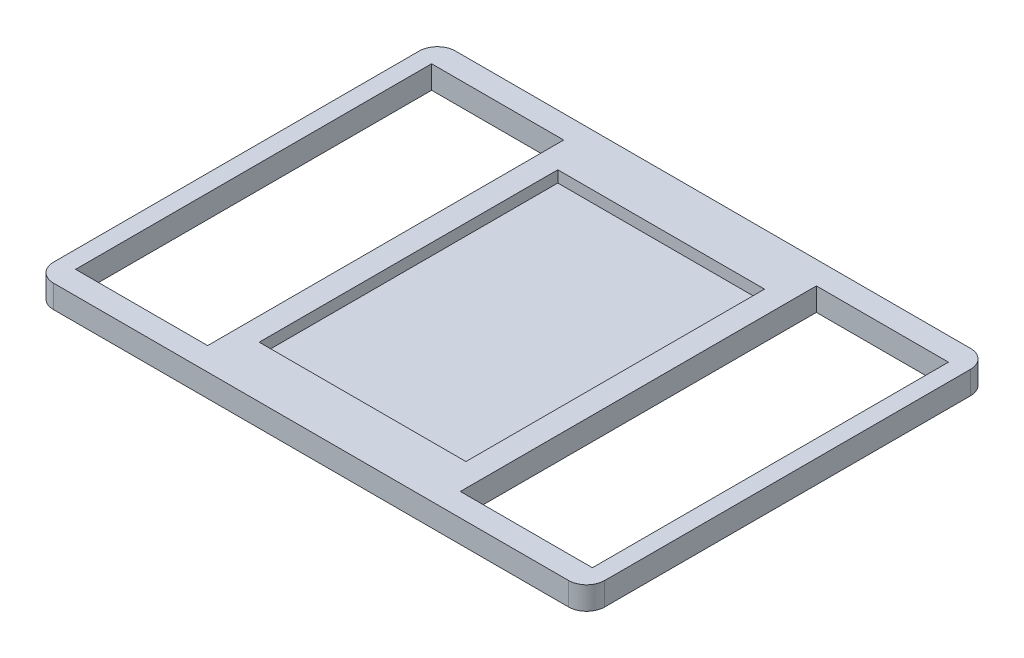
ISO-10303-21;
HEADER;
FILE_DESCRIPTION(('STEP AP214'),'2;1');
FILE_NAME('part.step','',(''),(''),'','','');
FILE_SCHEMA(('AUTOMOTIVE_DESIGN { 1 0 10303 214 1 1 1 1 }'));
ENDSEC;
DATA;
#1=APPLICATION_CONTEXT('core data for automotive mechanical design processes');
#2=APPLICATION_PROTOCOL_DEFINITION('international standard','automotive_design',2000,#1);
#3=PRODUCT_CONTEXT('',#1,'mechanical');
#4=PRODUCT('Part','Part','',(#3));
#5=PRODUCT_RELATED_PRODUCT_CATEGORY('part','',(#4));
#6=PRODUCT_DEFINITION_FORMATION('','',#4);
#7=PRODUCT_DEFINITION_CONTEXT('part definition',#1,'design');
#8=PRODUCT_DEFINITION('design','',#6,#7);
#9=PRODUCT_DEFINITION_SHAPE('','',#8);
#10=(LENGTH_UNIT() NAMED_UNIT(*) SI_UNIT(.MILLI.,.METRE.));
#11=(NAMED_UNIT(*) PLANE_ANGLE_UNIT() SI_UNIT($,.RADIAN.));
#12=(NAMED_UNIT(*) SI_UNIT($,.STERADIAN.) SOLID_ANGLE_UNIT());
#13=UNCERTAINTY_MEASURE_WITH_UNIT(LENGTH_MEASURE(1.E-05),#10,'distance_accuracy_value','');
#14=(GEOMETRIC_REPRESENTATION_CONTEXT(3) GLOBAL_UNCERTAINTY_ASSIGNED_CONTEXT((#13)) GLOBAL_UNIT_ASSIGNED_CONTEXT((#10,
#11,#12)) REPRESENTATION_CONTEXT('',''));
#15=CARTESIAN_POINT('',(0.,0.,0.));
#16=DIRECTION('',(0.,0.,1.));
#17=DIRECTION('',(1.,0.,0.));
#18=AXIS2_PLACEMENT_3D('',#15,#16,#17);
#19=CARTESIAN_POINT('',(4.79892037786772,12.7,0.));
#20=DIRECTION('',(1.,0.,0.));
#21=DIRECTION('',(0.,0.,-1.));
#22=AXIS2_PLACEMENT_3D('',#19,#20,#21);
#23=PLANE('',#22);
#24=DIRECTION('',(0.,0.,1.));
#25=VECTOR('',#24,1.);
#26=CARTESIAN_POINT('',(4.79892037786772,0.,0.));
#27=LINE('',#26,#25);
#28=CARTESIAN_POINT('',(4.79892037786772,0.,-212.25));
#29=VERTEX_POINT('',#28);
#30=CARTESIAN_POINT('',(4.79892037786772,0.,-10.));
#31=VERTEX_POINT('',#30);
#32=EDGE_CURVE('E275',#29,#31,#27,.T.);
#33=ORIENTED_EDGE('',*,*,#32,.T.);
#34=DIRECTION('',(0.,-1.,0.));
#35=VECTOR('',#34,1.);
#36=CARTESIAN_POINT('',(4.79892037786772,12.7,-10.));
#37=LINE('',#36,#35);
#38=CARTESIAN_POINT('',(4.79892037786772,12.7,-10.));
#39=VERTEX_POINT('',#38);
#40=EDGE_CURVE('E11',#31,#39,#37,.F.);
#41=ORIENTED_EDGE('',*,*,#40,.T.);
#42=DIRECTION('',(0.,0.,1.));
#43=VECTOR('',#42,1.);
#44=CARTESIAN_POINT('',(4.79892037786772,12.7,0.));
#45=LINE('',#44,#43);
#46=CARTESIAN_POINT('',(4.79892037786772,12.7,-212.25));
#47=VERTEX_POINT('',#46);
#48=EDGE_CURVE('E327',#47,#39,#45,.T.);
#49=ORIENTED_EDGE('',*,*,#48,.F.);
#50=DIRECTION('',(0.,-1.,0.));
#51=VECTOR('',#50,1.);
#52=CARTESIAN_POINT('',(4.79892037786772,12.7,-212.25));
#53=LINE('',#52,#51);
#54=EDGE_CURVE('E54',#47,#29,#53,.T.);
#55=ORIENTED_EDGE('',*,*,#54,.T.);
#56=EDGE_LOOP('',(#33,#41,#49,#55));
#57=FACE_BOUND('',#56,.T.);
#58=ADVANCED_FACE('F45',(#57),#23,.F.);
#59=CARTESIAN_POINT('',(4.79892037786772,12.7,0.));
#60=DIRECTION('',(0.,0.,-1.));
#61=DIRECTION('',(-1.,0.,0.));
#62=AXIS2_PLACEMENT_3D('',#59,#60,#61);
#63=PLANE('',#62);
#64=DIRECTION('',(1.,0.,0.));
#65=VECTOR('',#64,1.);
#66=CARTESIAN_POINT('',(4.79892037786772,0.,0.));
#67=LINE('',#66,#65);
#68=CARTESIAN_POINT('',(14.7989203778677,0.,0.));
#69=VERTEX_POINT('',#68);
#70=CARTESIAN_POINT('',(299.598920377868,0.,0.));
#71=VERTEX_POINT('',#70);
#72=EDGE_CURVE('E346',#69,#71,#67,.T.);
#73=ORIENTED_EDGE('',*,*,#72,.T.);
#74=DIRECTION('',(0.,-1.,0.));
#75=VECTOR('',#74,1.);
#76=CARTESIAN_POINT('',(299.598920377868,12.7,0.));
#77=LINE('',#76,#75);
#78=CARTESIAN_POINT('',(299.598920377868,12.7,0.));
#79=VERTEX_POINT('',#78);
#80=EDGE_CURVE('E61',#71,#79,#77,.F.);
#81=ORIENTED_EDGE('',*,*,#80,.T.);
#82=DIRECTION('',(1.,0.,0.));
#83=VECTOR('',#82,1.);
#84=CARTESIAN_POINT('',(4.79892037786772,12.7,0.));
#85=LINE('',#84,#83);
#86=CARTESIAN_POINT('',(14.7989203778677,12.7,0.));
#87=VERTEX_POINT('',#86);
#88=EDGE_CURVE('E330',#87,#79,#85,.T.);
#89=ORIENTED_EDGE('',*,*,#88,.F.);
#90=DIRECTION('',(0.,-1.,0.));
#91=VECTOR('',#90,1.);
#92=CARTESIAN_POINT('',(14.7989203778677,12.7,0.));
#93=LINE('',#92,#91);
#94=EDGE_CURVE('E392',#87,#69,#93,.T.);
#95=ORIENTED_EDGE('',*,*,#94,.T.);
#96=EDGE_LOOP('',(#73,#81,#89,#95));
#97=FACE_BOUND('',#96,.T.);
#98=ADVANCED_FACE('F413',(#97),#63,.F.);
#99=CARTESIAN_POINT('',(309.598920377868,12.7,0.));
#100=DIRECTION('',(-1.,0.,0.));
#101=DIRECTION('',(0.,0.,1.));
#102=AXIS2_PLACEMENT_3D('',#99,#100,#101);
#103=PLANE('',#102);
#104=DIRECTION('',(0.,0.,-1.));
#105=VECTOR('',#104,1.);
#106=CARTESIAN_POINT('',(309.598920377868,0.,0.));
#107=LINE('',#106,#105);
#108=CARTESIAN_POINT('',(309.598920377868,0.,-10.));
#109=VERTEX_POINT('',#108);
#110=CARTESIAN_POINT('',(309.598920377868,0.,-212.25));
#111=VERTEX_POINT('',#110);
#112=EDGE_CURVE('E349',#109,#111,#107,.T.);
#113=ORIENTED_EDGE('',*,*,#112,.T.);
#114=DIRECTION('',(0.,-1.,0.));
#115=VECTOR('',#114,1.);
#116=CARTESIAN_POINT('',(309.598920377868,12.7,-212.25));
#117=LINE('',#116,#115);
#118=CARTESIAN_POINT('',(309.598920377868,12.7,-212.25));
#119=VERTEX_POINT('',#118);
#120=EDGE_CURVE('E378',#111,#119,#117,.F.);
#121=ORIENTED_EDGE('',*,*,#120,.T.);
#122=DIRECTION('',(0.,0.,-1.));
#123=VECTOR('',#122,1.);
#124=CARTESIAN_POINT('',(309.598920377868,12.7,0.));
#125=LINE('',#124,#123);
#126=CARTESIAN_POINT('',(309.598920377868,12.7,-10.));
#127=VERTEX_POINT('',#126);
#128=EDGE_CURVE('E334',#127,#119,#125,.T.);
#129=ORIENTED_EDGE('',*,*,#128,.F.);
#130=DIRECTION('',(0.,-1.,0.));
#131=VECTOR('',#130,1.);
#132=CARTESIAN_POINT('',(309.598920377868,12.7,-10.));
#133=LINE('',#132,#131);
#134=EDGE_CURVE('E374',#127,#109,#133,.T.);
#135=ORIENTED_EDGE('',*,*,#134,.T.);
#136=EDGE_LOOP('',(#113,#121,#129,#135));
#137=FACE_BOUND('',#136,.T.);
#138=ADVANCED_FACE('F422',(#137),#103,.F.);
#139=CARTESIAN_POINT('',(4.79892037786772,12.7,-222.25));
#140=DIRECTION('',(0.,0.,1.));
#141=DIRECTION('',(1.,0.,0.));
#142=AXIS2_PLACEMENT_3D('',#139,#140,#141);
#143=PLANE('',#142);
#144=DIRECTION('',(-1.,0.,0.));
#145=VECTOR('',#144,1.);
#146=CARTESIAN_POINT('',(4.79892037786772,12.7,-222.25));
#147=LINE('',#146,#145);
#148=CARTESIAN_POINT('',(299.598920377868,12.7,-222.25));
#149=VERTEX_POINT('',#148);
#150=CARTESIAN_POINT('',(14.7989203778677,12.7,-222.25));
#151=VERTEX_POINT('',#150);
#152=EDGE_CURVE('E338',#149,#151,#147,.T.);
#153=ORIENTED_EDGE('',*,*,#152,.F.);
#154=DIRECTION('',(0.,-1.,0.));
#155=VECTOR('',#154,1.);
#156=CARTESIAN_POINT('',(299.598920377868,12.7,-222.25));
#157=LINE('',#156,#155);
#158=CARTESIAN_POINT('',(299.598920377868,0.,-222.25));
#159=VERTEX_POINT('',#158);
#160=EDGE_CURVE('E358',#149,#159,#157,.T.);
#161=ORIENTED_EDGE('',*,*,#160,.T.);
#162=DIRECTION('',(-1.,0.,0.));
#163=VECTOR('',#162,1.);
#164=CARTESIAN_POINT('',(4.79892037786772,0.,-222.25));
#165=LINE('',#164,#163);
#166=CARTESIAN_POINT('',(14.7989203778677,0.,-222.25));
#167=VERTEX_POINT('',#166);
#168=EDGE_CURVE('E331',#159,#167,#165,.T.);
#169=ORIENTED_EDGE('',*,*,#168,.T.);
#170=DIRECTION('',(0.,-1.,0.));
#171=VECTOR('',#170,1.);
#172=CARTESIAN_POINT('',(14.7989203778677,12.7,-222.25));
#173=LINE('',#172,#171);
#174=EDGE_CURVE('E342',#167,#151,#173,.F.);
#175=ORIENTED_EDGE('',*,*,#174,.T.);
#176=EDGE_LOOP('',(#153,#161,#169,#175));
#177=FACE_BOUND('',#176,.T.);
#178=ADVANCED_FACE('F430',(#177),#143,.F.);
#179=CARTESIAN_POINT('',(0.,12.7,0.));
#180=DIRECTION('',(0.,-1.,0.));
#181=DIRECTION('',(0.,0.,-1.));
#182=AXIS2_PLACEMENT_3D('',#179,#180,#181);
#183=PLANE('',#182);
#184=DIRECTION('',(1.,0.,0.));
#185=VECTOR('',#184,1.);
#186=CARTESIAN_POINT('',(99.9733942441962,12.7,-28.575));
#187=LINE('',#186,#185);
#188=CARTESIAN_POINT('',(99.9733942441962,12.7,-28.575));
#189=VERTEX_POINT('',#188);
#190=CARTESIAN_POINT('',(214.273394244196,12.7,-28.575));
#191=VERTEX_POINT('',#190);
#192=EDGE_CURVE('E224',#189,#191,#187,.T.);
#193=ORIENTED_EDGE('',*,*,#192,.F.);
#194=DIRECTION('',(0.,0.,1.));
#195=VECTOR('',#194,1.);
#196=CARTESIAN_POINT('',(99.9733942441962,12.7,-193.675));
#197=LINE('',#196,#195);
#198=CARTESIAN_POINT('',(99.9733942441962,12.7,-193.675));
#199=VERTEX_POINT('',#198);
#200=EDGE_CURVE('E191',#199,#189,#197,.T.);
#201=ORIENTED_EDGE('',*,*,#200,.F.);
#202=DIRECTION('',(-1.,0.,0.));
#203=VECTOR('',#202,1.);
#204=CARTESIAN_POINT('',(99.9733942441962,12.7,-193.675));
#205=LINE('',#204,#203);
#206=CARTESIAN_POINT('',(214.273394244196,12.7,-193.675));
#207=VERTEX_POINT('',#206);
#208=EDGE_CURVE('E211',#207,#199,#205,.T.);
#209=ORIENTED_EDGE('',*,*,#208,.F.);
#210=DIRECTION('',(0.,0.,-1.));
#211=VECTOR('',#210,1.);
#212=CARTESIAN_POINT('',(214.273394244196,12.7,-193.675));
#213=LINE('',#212,#211);
#214=EDGE_CURVE('E215',#191,#207,#213,.T.);
#215=ORIENTED_EDGE('',*,*,#214,.F.);
#216=EDGE_LOOP('',(#193,#201,#209,#215));
#217=FACE_BOUND('',#216,.T.);
#218=DIRECTION('',(1.,0.,0.));
#219=VECTOR('',#218,1.);
#220=CARTESIAN_POINT('',(14.3239203778677,12.7,-12.7));
#221=LINE('',#220,#219);
#222=CARTESIAN_POINT('',(14.3239203778677,12.7,-12.7));
#223=VERTEX_POINT('',#222);
#224=CARTESIAN_POINT('',(87.3489203778677,12.7,-12.7));
#225=VERTEX_POINT('',#224);
#226=EDGE_CURVE('E260',#223,#225,#221,.T.);
#227=ORIENTED_EDGE('',*,*,#226,.F.);
#228=DIRECTION('',(0.,0.,1.));
#229=VECTOR('',#228,1.);
#230=CARTESIAN_POINT('',(14.3239203778677,12.7,-209.55));
#231=LINE('',#230,#229);
#232=CARTESIAN_POINT('',(14.3239203778677,12.7,-209.55));
#233=VERTEX_POINT('',#232);
#234=EDGE_CURVE('E257',#233,#223,#231,.T.);
#235=ORIENTED_EDGE('',*,*,#234,.F.);
#236=DIRECTION('',(-1.,0.,0.));
#237=VECTOR('',#236,1.);
#238=CARTESIAN_POINT('',(14.3239203778677,12.7,-209.55));
#239=LINE('',#238,#237);
#240=CARTESIAN_POINT('',(87.3489203778677,12.7,-209.55));
#241=VERTEX_POINT('',#240);
#242=EDGE_CURVE('E244',#241,#233,#239,.T.);
#243=ORIENTED_EDGE('',*,*,#242,.F.);
#244=DIRECTION('',(0.,0.,-1.));
#245=VECTOR('',#244,1.);
#246=CARTESIAN_POINT('',(87.3489203778677,12.7,-209.55));
#247=LINE('',#246,#245);
#248=EDGE_CURVE('E265',#225,#241,#247,.T.);
#249=ORIENTED_EDGE('',*,*,#248,.F.);
#250=EDGE_LOOP('',(#227,#235,#243,#249));
#251=FACE_BOUND('',#250,.T.);
#252=DIRECTION('',(1.,0.,0.));
#253=VECTOR('',#252,1.);
#254=CARTESIAN_POINT('',(227.048920377868,12.7,-12.7));
#255=LINE('',#254,#253);
#256=CARTESIAN_POINT('',(227.048920377868,12.7,-12.7));
#257=VERTEX_POINT('',#256);
#258=CARTESIAN_POINT('',(300.073920377868,12.7,-12.7));
#259=VERTEX_POINT('',#258);
#260=EDGE_CURVE('E307',#257,#259,#255,.T.);
#261=ORIENTED_EDGE('',*,*,#260,.F.);
#262=DIRECTION('',(0.,0.,1.));
#263=VECTOR('',#262,1.);
#264=CARTESIAN_POINT('',(227.048920377868,12.7,-209.55));
#265=LINE('',#264,#263);
#266=CARTESIAN_POINT('',(227.048920377868,12.7,-209.55));
#267=VERTEX_POINT('',#266);
#268=EDGE_CURVE('E261',#267,#257,#265,.T.);
#269=ORIENTED_EDGE('',*,*,#268,.F.);
#270=DIRECTION('',(-1.,0.,0.));
#271=VECTOR('',#270,1.);
#272=CARTESIAN_POINT('',(227.048920377868,12.7,-209.55));
#273=LINE('',#272,#271);
#274=CARTESIAN_POINT('',(300.073920377868,12.7,-209.55));
#275=VERTEX_POINT('',#274);
#276=EDGE_CURVE('E298',#275,#267,#273,.T.);
#277=ORIENTED_EDGE('',*,*,#276,.F.);
#278=DIRECTION('',(0.,0.,-1.));
#279=VECTOR('',#278,1.);
#280=CARTESIAN_POINT('',(300.073920377868,12.7,-209.55));
#281=LINE('',#280,#279);
#282=EDGE_CURVE('E302',#259,#275,#281,.T.);
#283=ORIENTED_EDGE('',*,*,#282,.F.);
#284=EDGE_LOOP('',(#261,#269,#277,#283));
#285=FACE_BOUND('',#284,.T.);
#286=ORIENTED_EDGE('',*,*,#128,.T.);
#287=CARTESIAN_POINT('',(299.598920377868,12.7,-212.25));
#288=DIRECTION('',(0.,-1.,0.));
#289=DIRECTION('',(0.,0.,-1.));
#290=AXIS2_PLACEMENT_3D('',#287,#288,#289);
#291=CIRCLE('',#290,10.);
#292=EDGE_CURVE('E389',#119,#149,#291,.F.);
#293=ORIENTED_EDGE('',*,*,#292,.T.);
#294=ORIENTED_EDGE('',*,*,#152,.T.);
#295=CARTESIAN_POINT('',(14.7989203778677,12.7,-212.25));
#296=DIRECTION('',(0.,-1.,0.));
#297=DIRECTION('',(0.,0.,-1.));
#298=AXIS2_PLACEMENT_3D('',#295,#296,#297);
#299=CIRCLE('',#298,10.);
#300=EDGE_CURVE('E381',#151,#47,#299,.F.);
#301=ORIENTED_EDGE('',*,*,#300,.T.);
#302=ORIENTED_EDGE('',*,*,#48,.T.);
#303=CARTESIAN_POINT('',(14.7989203778677,12.7,-10.));
#304=DIRECTION('',(0.,-1.,0.));
#305=DIRECTION('',(0.,0.,-1.));
#306=AXIS2_PLACEMENT_3D('',#303,#304,#305);
#307=CIRCLE('',#306,10.);
#308=EDGE_CURVE('E68',#39,#87,#307,.F.);
#309=ORIENTED_EDGE('',*,*,#308,.T.);
#310=ORIENTED_EDGE('',*,*,#88,.T.);
#311=CARTESIAN_POINT('',(299.598920377868,12.7,-10.));
#312=DIRECTION('',(0.,-1.,0.));
#313=DIRECTION('',(0.,0.,-1.));
#314=AXIS2_PLACEMENT_3D('',#311,#312,#313);
#315=CIRCLE('',#314,10.);
#316=EDGE_CURVE('E386',#79,#127,#315,.F.);
#317=ORIENTED_EDGE('',*,*,#316,.T.);
#318=EDGE_LOOP('',(#286,#293,#294,#301,#302,#309,#310,#317));
#319=FACE_BOUND('',#318,.T.);
#320=ADVANCED_FACE('F415',(#217,#251,#285,#319),#183,.F.);
#321=CARTESIAN_POINT('',(0.,0.,0.));
#322=DIRECTION('',(0.,-1.,0.));
#323=DIRECTION('',(0.,0.,-1.));
#324=AXIS2_PLACEMENT_3D('',#321,#322,#323);
#325=PLANE('',#324);
#326=DIRECTION('',(0.,0.,1.));
#327=VECTOR('',#326,1.);
#328=CARTESIAN_POINT('',(14.3239203778677,0.,-209.55));
#329=LINE('',#328,#327);
#330=CARTESIAN_POINT('',(14.3239203778677,0.,-209.55));
#331=VERTEX_POINT('',#330);
#332=CARTESIAN_POINT('',(14.3239203778677,0.,-12.7));
#333=VERTEX_POINT('',#332);
#334=EDGE_CURVE('E239',#331,#333,#329,.T.);
#335=ORIENTED_EDGE('',*,*,#334,.T.);
#336=DIRECTION('',(1.,0.,0.));
#337=VECTOR('',#336,1.);
#338=CARTESIAN_POINT('',(14.3239203778677,0.,-12.7));
#339=LINE('',#338,#337);
#340=CARTESIAN_POINT('',(87.3489203778677,0.,-12.7));
#341=VERTEX_POINT('',#340);
#342=EDGE_CURVE('E243',#333,#341,#339,.T.);
#343=ORIENTED_EDGE('',*,*,#342,.T.);
#344=DIRECTION('',(0.,0.,-1.));
#345=VECTOR('',#344,1.);
#346=CARTESIAN_POINT('',(87.3489203778677,0.,-209.55));
#347=LINE('',#346,#345);
#348=CARTESIAN_POINT('',(87.3489203778677,0.,-209.55));
#349=VERTEX_POINT('',#348);
#350=EDGE_CURVE('E248',#341,#349,#347,.T.);
#351=ORIENTED_EDGE('',*,*,#350,.T.);
#352=DIRECTION('',(-1.,0.,0.));
#353=VECTOR('',#352,1.);
#354=CARTESIAN_POINT('',(14.3239203778677,0.,-209.55));
#355=LINE('',#354,#353);
#356=EDGE_CURVE('E252',#349,#331,#355,.T.);
#357=ORIENTED_EDGE('',*,*,#356,.T.);
#358=EDGE_LOOP('',(#335,#343,#351,#357));
#359=FACE_BOUND('',#358,.T.);
#360=DIRECTION('',(0.,0.,1.));
#361=VECTOR('',#360,1.);
#362=CARTESIAN_POINT('',(227.048920377868,0.,-209.55));
#363=LINE('',#362,#361);
#364=CARTESIAN_POINT('',(227.048920377868,0.,-209.55));
#365=VERTEX_POINT('',#364);
#366=CARTESIAN_POINT('',(227.048920377868,0.,-12.7));
#367=VERTEX_POINT('',#366);
#368=EDGE_CURVE('E303',#365,#367,#363,.T.);
#369=ORIENTED_EDGE('',*,*,#368,.T.);
#370=DIRECTION('',(1.,0.,0.));
#371=VECTOR('',#370,1.);
#372=CARTESIAN_POINT('',(227.048920377868,0.,-12.7));
#373=LINE('',#372,#371);
#374=CARTESIAN_POINT('',(300.073920377868,0.,-12.7));
#375=VERTEX_POINT('',#374);
#376=EDGE_CURVE('E320',#367,#375,#373,.T.);
#377=ORIENTED_EDGE('',*,*,#376,.T.);
#378=DIRECTION('',(0.,0.,-1.));
#379=VECTOR('',#378,1.);
#380=CARTESIAN_POINT('',(300.073920377868,0.,-209.55));
#381=LINE('',#380,#379);
#382=CARTESIAN_POINT('',(300.073920377868,0.,-209.55));
#383=VERTEX_POINT('',#382);
#384=EDGE_CURVE('E316',#375,#383,#381,.T.);
#385=ORIENTED_EDGE('',*,*,#384,.T.);
#386=DIRECTION('',(-1.,0.,0.));
#387=VECTOR('',#386,1.);
#388=CARTESIAN_POINT('',(227.048920377868,0.,-209.55));
#389=LINE('',#388,#387);
#390=EDGE_CURVE('E289',#383,#365,#389,.T.);
#391=ORIENTED_EDGE('',*,*,#390,.T.);
#392=EDGE_LOOP('',(#369,#377,#385,#391));
#393=FACE_BOUND('',#392,.T.);
#394=ORIENTED_EDGE('',*,*,#168,.F.);
#395=CARTESIAN_POINT('',(299.598920377868,0.,-212.25));
#396=DIRECTION('',(0.,-1.,0.));
#397=DIRECTION('',(0.,0.,-1.));
#398=AXIS2_PLACEMENT_3D('',#395,#396,#397);
#399=CIRCLE('',#398,10.);
#400=EDGE_CURVE('E371',#159,#111,#399,.T.);
#401=ORIENTED_EDGE('',*,*,#400,.T.);
#402=ORIENTED_EDGE('',*,*,#112,.F.);
#403=CARTESIAN_POINT('',(299.598920377868,0.,-10.));
#404=DIRECTION('',(0.,-1.,0.));
#405=DIRECTION('',(0.,0.,-1.));
#406=AXIS2_PLACEMENT_3D('',#403,#404,#405);
#407=CIRCLE('',#406,10.);
#408=EDGE_CURVE('E368',#109,#71,#407,.T.);
#409=ORIENTED_EDGE('',*,*,#408,.T.);
#410=ORIENTED_EDGE('',*,*,#72,.F.);
#411=CARTESIAN_POINT('',(14.7989203778677,0.,-10.));
#412=DIRECTION('',(0.,-1.,0.));
#413=DIRECTION('',(0.,0.,-1.));
#414=AXIS2_PLACEMENT_3D('',#411,#412,#413);
#415=CIRCLE('',#414,10.);
#416=EDGE_CURVE('E365',#69,#31,#415,.T.);
#417=ORIENTED_EDGE('',*,*,#416,.T.);
#418=ORIENTED_EDGE('',*,*,#32,.F.);
#419=CARTESIAN_POINT('',(14.7989203778677,0.,-212.25));
#420=DIRECTION('',(0.,-1.,0.));
#421=DIRECTION('',(0.,0.,-1.));
#422=AXIS2_PLACEMENT_3D('',#419,#420,#421);
#423=CIRCLE('',#422,10.);
#424=EDGE_CURVE('E362',#29,#167,#423,.T.);
#425=ORIENTED_EDGE('',*,*,#424,.T.);
#426=EDGE_LOOP('',(#394,#401,#402,#409,#410,#417,#418,#425));
#427=FACE_BOUND('',#426,.T.);
#428=ADVANCED_FACE('F408',(#359,#393,#427),#325,.T.);
#429=CARTESIAN_POINT('',(227.048920377868,0.,-209.55));
#430=DIRECTION('',(-1.,0.,0.));
#431=DIRECTION('',(0.,0.,1.));
#432=AXIS2_PLACEMENT_3D('',#429,#430,#431);
#433=PLANE('',#432);
#434=ORIENTED_EDGE('',*,*,#268,.T.);
#435=DIRECTION('',(0.,1.,0.));
#436=VECTOR('',#435,1.);
#437=CARTESIAN_POINT('',(227.048920377868,0.,-12.7));
#438=LINE('',#437,#436);
#439=EDGE_CURVE('E285',#367,#257,#438,.T.);
#440=ORIENTED_EDGE('',*,*,#439,.F.);
#441=ORIENTED_EDGE('',*,*,#368,.F.);
#442=DIRECTION('',(0.,1.,0.));
#443=VECTOR('',#442,1.);
#444=CARTESIAN_POINT('',(227.048920377868,0.,-209.55));
#445=LINE('',#444,#443);
#446=EDGE_CURVE('E233',#365,#267,#445,.T.);
#447=ORIENTED_EDGE('',*,*,#446,.T.);
#448=EDGE_LOOP('',(#434,#440,#441,#447));
#449=FACE_BOUND('',#448,.T.);
#450=ADVANCED_FACE('F569',(#449),#433,.F.);
#451=CARTESIAN_POINT('',(227.048920377868,0.,-209.55));
#452=DIRECTION('',(0.,0.,-1.));
#453=DIRECTION('',(-1.,0.,0.));
#454=AXIS2_PLACEMENT_3D('',#451,#452,#453);
#455=PLANE('',#454);
#456=ORIENTED_EDGE('',*,*,#276,.T.);
#457=ORIENTED_EDGE('',*,*,#446,.F.);
#458=ORIENTED_EDGE('',*,*,#390,.F.);
#459=DIRECTION('',(0.,1.,0.));
#460=VECTOR('',#459,1.);
#461=CARTESIAN_POINT('',(300.073920377868,0.,-209.55));
#462=LINE('',#461,#460);
#463=EDGE_CURVE('E293',#383,#275,#462,.T.);
#464=ORIENTED_EDGE('',*,*,#463,.T.);
#465=EDGE_LOOP('',(#456,#457,#458,#464));
#466=FACE_BOUND('',#465,.T.);
#467=ADVANCED_FACE('F560',(#466),#455,.F.);
#468=CARTESIAN_POINT('',(300.073920377868,0.,-209.55));
#469=DIRECTION('',(1.,0.,0.));
#470=DIRECTION('',(0.,0.,-1.));
#471=AXIS2_PLACEMENT_3D('',#468,#469,#470);
#472=PLANE('',#471);
#473=ORIENTED_EDGE('',*,*,#282,.T.);
#474=ORIENTED_EDGE('',*,*,#463,.F.);
#475=ORIENTED_EDGE('',*,*,#384,.F.);
#476=DIRECTION('',(0.,1.,0.));
#477=VECTOR('',#476,1.);
#478=CARTESIAN_POINT('',(300.073920377868,0.,-12.7));
#479=LINE('',#478,#477);
#480=EDGE_CURVE('E290',#375,#259,#479,.T.);
#481=ORIENTED_EDGE('',*,*,#480,.T.);
#482=EDGE_LOOP('',(#473,#474,#475,#481));
#483=FACE_BOUND('',#482,.T.);
#484=ADVANCED_FACE('F551',(#483),#472,.F.);
#485=CARTESIAN_POINT('',(227.048920377868,0.,-12.7));
#486=DIRECTION('',(0.,0.,1.));
#487=DIRECTION('',(1.,0.,0.));
#488=AXIS2_PLACEMENT_3D('',#485,#486,#487);
#489=PLANE('',#488);
#490=ORIENTED_EDGE('',*,*,#260,.T.);
#491=ORIENTED_EDGE('',*,*,#480,.F.);
#492=ORIENTED_EDGE('',*,*,#376,.F.);
#493=ORIENTED_EDGE('',*,*,#439,.T.);
#494=EDGE_LOOP('',(#490,#491,#492,#493));
#495=FACE_BOUND('',#494,.T.);
#496=ADVANCED_FACE('F542',(#495),#489,.F.);
#497=CARTESIAN_POINT('',(14.3239203778677,0.,-209.55));
#498=DIRECTION('',(-1.,0.,0.));
#499=DIRECTION('',(0.,0.,1.));
#500=AXIS2_PLACEMENT_3D('',#497,#498,#499);
#501=PLANE('',#500);
#502=ORIENTED_EDGE('',*,*,#234,.T.);
#503=DIRECTION('',(0.,1.,0.));
#504=VECTOR('',#503,1.);
#505=CARTESIAN_POINT('',(14.3239203778677,0.,-12.7));
#506=LINE('',#505,#504);
#507=EDGE_CURVE('E256',#333,#223,#506,.T.);
#508=ORIENTED_EDGE('',*,*,#507,.F.);
#509=ORIENTED_EDGE('',*,*,#334,.F.);
#510=DIRECTION('',(0.,1.,0.));
#511=VECTOR('',#510,1.);
#512=CARTESIAN_POINT('',(14.3239203778677,0.,-209.55));
#513=LINE('',#512,#511);
#514=EDGE_CURVE('E272',#331,#233,#513,.T.);
#515=ORIENTED_EDGE('',*,*,#514,.T.);
#516=EDGE_LOOP('',(#502,#508,#509,#515));
#517=FACE_BOUND('',#516,.T.);
#518=ADVANCED_FACE('F533',(#517),#501,.F.);
#519=CARTESIAN_POINT('',(14.3239203778677,0.,-209.55));
#520=DIRECTION('',(0.,0.,-1.));
#521=DIRECTION('',(-1.,0.,0.));
#522=AXIS2_PLACEMENT_3D('',#519,#520,#521);
#523=PLANE('',#522);
#524=ORIENTED_EDGE('',*,*,#242,.T.);
#525=ORIENTED_EDGE('',*,*,#514,.F.);
#526=ORIENTED_EDGE('',*,*,#356,.F.);
#527=DIRECTION('',(0.,1.,0.));
#528=VECTOR('',#527,1.);
#529=CARTESIAN_POINT('',(87.3489203778677,0.,-209.55));
#530=LINE('',#529,#528);
#531=EDGE_CURVE('E276',#349,#241,#530,.T.);
#532=ORIENTED_EDGE('',*,*,#531,.T.);
#533=EDGE_LOOP('',(#524,#525,#526,#532));
#534=FACE_BOUND('',#533,.T.);
#535=ADVANCED_FACE('F524',(#534),#523,.F.);
#536=CARTESIAN_POINT('',(87.3489203778677,0.,-209.55));
#537=DIRECTION('',(1.,0.,0.));
#538=DIRECTION('',(0.,0.,-1.));
#539=AXIS2_PLACEMENT_3D('',#536,#537,#538);
#540=PLANE('',#539);
#541=ORIENTED_EDGE('',*,*,#248,.T.);
#542=ORIENTED_EDGE('',*,*,#531,.F.);
#543=ORIENTED_EDGE('',*,*,#350,.F.);
#544=DIRECTION('',(0.,1.,0.));
#545=VECTOR('',#544,1.);
#546=CARTESIAN_POINT('',(87.3489203778677,0.,-12.7));
#547=LINE('',#546,#545);
#548=EDGE_CURVE('E279',#341,#225,#547,.T.);
#549=ORIENTED_EDGE('',*,*,#548,.T.);
#550=EDGE_LOOP('',(#541,#542,#543,#549));
#551=FACE_BOUND('',#550,.T.);
#552=ADVANCED_FACE('F515',(#551),#540,.F.);
#553=CARTESIAN_POINT('',(14.3239203778677,0.,-12.7));
#554=DIRECTION('',(0.,0.,1.));
#555=DIRECTION('',(1.,0.,0.));
#556=AXIS2_PLACEMENT_3D('',#553,#554,#555);
#557=PLANE('',#556);
#558=ORIENTED_EDGE('',*,*,#226,.T.);
#559=ORIENTED_EDGE('',*,*,#548,.F.);
#560=ORIENTED_EDGE('',*,*,#342,.F.);
#561=ORIENTED_EDGE('',*,*,#507,.T.);
#562=EDGE_LOOP('',(#558,#559,#560,#561));
#563=FACE_BOUND('',#562,.T.);
#564=ADVANCED_FACE('F507',(#563),#557,.F.);
#565=CARTESIAN_POINT('',(99.9733942441962,6.35,-193.675));
#566=DIRECTION('',(-1.,0.,0.));
#567=DIRECTION('',(0.,0.,1.));
#568=AXIS2_PLACEMENT_3D('',#565,#566,#567);
#569=PLANE('',#568);
#570=ORIENTED_EDGE('',*,*,#200,.T.);
#571=DIRECTION('',(0.,1.,0.));
#572=VECTOR('',#571,1.);
#573=CARTESIAN_POINT('',(99.9733942441962,6.35,-28.575));
#574=LINE('',#573,#572);
#575=CARTESIAN_POINT('',(99.9733942441962,6.35,-28.575));
#576=VERTEX_POINT('',#575);
#577=EDGE_CURVE('E184',#576,#189,#574,.T.);
#578=ORIENTED_EDGE('',*,*,#577,.F.);
#579=DIRECTION('',(0.,0.,1.));
#580=VECTOR('',#579,1.);
#581=CARTESIAN_POINT('',(99.9733942441962,6.35,-193.675));
#582=LINE('',#581,#580);
#583=CARTESIAN_POINT('',(99.9733942441962,6.35,-193.675));
#584=VERTEX_POINT('',#583);
#585=EDGE_CURVE('E188',#584,#576,#582,.T.);
#586=ORIENTED_EDGE('',*,*,#585,.F.);
#587=DIRECTION('',(0.,1.,0.));
#588=VECTOR('',#587,1.);
#589=CARTESIAN_POINT('',(99.9733942441962,6.35,-193.675));
#590=LINE('',#589,#588);
#591=EDGE_CURVE('E230',#584,#199,#590,.T.);
#592=ORIENTED_EDGE('',*,*,#591,.T.);
#593=EDGE_LOOP('',(#570,#578,#586,#592));
#594=FACE_BOUND('',#593,.T.);
#595=ADVANCED_FACE('F186',(#594),#569,.F.);
#596=CARTESIAN_POINT('',(99.9733942441962,6.35,-193.675));
#597=DIRECTION('',(0.,0.,-1.));
#598=DIRECTION('',(-1.,0.,0.));
#599=AXIS2_PLACEMENT_3D('',#596,#597,#598);
#600=PLANE('',#599);
#601=ORIENTED_EDGE('',*,*,#208,.T.);
#602=ORIENTED_EDGE('',*,*,#591,.F.);
#603=DIRECTION('',(-1.,0.,0.));
#604=VECTOR('',#603,1.);
#605=CARTESIAN_POINT('',(99.9733942441962,6.35,-193.675));
#606=LINE('',#605,#604);
#607=CARTESIAN_POINT('',(214.273394244196,6.35,-193.675));
#608=VERTEX_POINT('',#607);
#609=EDGE_CURVE('E197',#608,#584,#606,.T.);
#610=ORIENTED_EDGE('',*,*,#609,.F.);
#611=DIRECTION('',(0.,1.,0.));
#612=VECTOR('',#611,1.);
#613=CARTESIAN_POINT('',(214.273394244196,6.35,-193.675));
#614=LINE('',#613,#612);
#615=EDGE_CURVE('E234',#608,#207,#614,.T.);
#616=ORIENTED_EDGE('',*,*,#615,.T.);
#617=EDGE_LOOP('',(#601,#602,#610,#616));
#618=FACE_BOUND('',#617,.T.);
#619=ADVANCED_FACE('F490',(#618),#600,.F.);
#620=CARTESIAN_POINT('',(214.273394244196,6.35,-193.675));
#621=DIRECTION('',(1.,0.,0.));
#622=DIRECTION('',(0.,0.,-1.));
#623=AXIS2_PLACEMENT_3D('',#620,#621,#622);
#624=PLANE('',#623);
#625=ORIENTED_EDGE('',*,*,#214,.T.);
#626=ORIENTED_EDGE('',*,*,#615,.F.);
#627=DIRECTION('',(0.,0.,-1.));
#628=VECTOR('',#627,1.);
#629=CARTESIAN_POINT('',(214.273394244196,6.35,-193.675));
#630=LINE('',#629,#628);
#631=CARTESIAN_POINT('',(214.273394244196,6.35,-28.575));
#632=VERTEX_POINT('',#631);
#633=EDGE_CURVE('E206',#632,#608,#630,.T.);
#634=ORIENTED_EDGE('',*,*,#633,.F.);
#635=DIRECTION('',(0.,1.,0.));
#636=VECTOR('',#635,1.);
#637=CARTESIAN_POINT('',(214.273394244196,6.35,-28.575));
#638=LINE('',#637,#636);
#639=EDGE_CURVE('E196',#632,#191,#638,.T.);
#640=ORIENTED_EDGE('',*,*,#639,.T.);
#641=EDGE_LOOP('',(#625,#626,#634,#640));
#642=FACE_BOUND('',#641,.T.);
#643=ADVANCED_FACE('F482',(#642),#624,.F.);
#644=CARTESIAN_POINT('',(99.9733942441962,6.35,-28.575));
#645=DIRECTION('',(0.,0.,1.));
#646=DIRECTION('',(1.,0.,0.));
#647=AXIS2_PLACEMENT_3D('',#644,#645,#646);
#648=PLANE('',#647);
#649=ORIENTED_EDGE('',*,*,#192,.T.);
#650=ORIENTED_EDGE('',*,*,#639,.F.);
#651=DIRECTION('',(1.,0.,0.));
#652=VECTOR('',#651,1.);
#653=CARTESIAN_POINT('',(99.9733942441962,6.35,-28.575));
#654=LINE('',#653,#652);
#655=EDGE_CURVE('E200',#576,#632,#654,.T.);
#656=ORIENTED_EDGE('',*,*,#655,.F.);
#657=ORIENTED_EDGE('',*,*,#577,.T.);
#658=EDGE_LOOP('',(#649,#650,#656,#657));
#659=FACE_BOUND('',#658,.T.);
#660=ADVANCED_FACE('F201',(#659),#648,.F.);
#661=CARTESIAN_POINT('',(0.,6.35,0.));
#662=DIRECTION('',(0.,1.,0.));
#663=DIRECTION('',(0.,0.,1.));
#664=AXIS2_PLACEMENT_3D('',#661,#662,#663);
#665=PLANE('',#664);
#666=ORIENTED_EDGE('',*,*,#585,.T.);
#667=ORIENTED_EDGE('',*,*,#655,.T.);
#668=ORIENTED_EDGE('',*,*,#633,.T.);
#669=ORIENTED_EDGE('',*,*,#609,.T.);
#670=EDGE_LOOP('',(#666,#667,#668,#669));
#671=FACE_BOUND('',#670,.T.);
#672=ADVANCED_FACE('F208',(#671),#665,.T.);
#673=CARTESIAN_POINT('',(299.598920377868,12.7,-212.25));
#674=DIRECTION('',(0.,-1.,0.));
#675=DIRECTION('',(0.,0.,-1.));
#676=AXIS2_PLACEMENT_3D('',#673,#674,#675);
#677=CYLINDRICAL_SURFACE('',#676,10.);
#678=ORIENTED_EDGE('',*,*,#292,.F.);
#679=ORIENTED_EDGE('',*,*,#120,.F.);
#680=ORIENTED_EDGE('',*,*,#400,.F.);
#681=ORIENTED_EDGE('',*,*,#160,.F.);
#682=EDGE_LOOP('',(#678,#679,#680,#681));
#683=FACE_BOUND('',#682,.T.);
#684=ADVANCED_FACE('F427',(#683),#677,.T.);
#685=CARTESIAN_POINT('',(299.598920377868,12.7,-10.));
#686=DIRECTION('',(0.,-1.,0.));
#687=DIRECTION('',(0.,0.,-1.));
#688=AXIS2_PLACEMENT_3D('',#685,#686,#687);
#689=CYLINDRICAL_SURFACE('',#688,10.);
#690=ORIENTED_EDGE('',*,*,#316,.F.);
#691=ORIENTED_EDGE('',*,*,#80,.F.);
#692=ORIENTED_EDGE('',*,*,#408,.F.);
#693=ORIENTED_EDGE('',*,*,#134,.F.);
#694=EDGE_LOOP('',(#690,#691,#692,#693));
#695=FACE_BOUND('',#694,.T.);
#696=ADVANCED_FACE('F419',(#695),#689,.T.);
#697=CARTESIAN_POINT('',(14.7989203778677,12.7,-10.));
#698=DIRECTION('',(0.,-1.,0.));
#699=DIRECTION('',(0.,0.,-1.));
#700=AXIS2_PLACEMENT_3D('',#697,#698,#699);
#701=CYLINDRICAL_SURFACE('',#700,10.);
#702=ORIENTED_EDGE('',*,*,#308,.F.);
#703=ORIENTED_EDGE('',*,*,#40,.F.);
#704=ORIENTED_EDGE('',*,*,#416,.F.);
#705=ORIENTED_EDGE('',*,*,#94,.F.);
#706=EDGE_LOOP('',(#702,#703,#704,#705));
#707=FACE_BOUND('',#706,.T.);
#708=ADVANCED_FACE('F412',(#707),#701,.T.);
#709=CARTESIAN_POINT('',(14.7989203778677,12.7,-212.25));
#710=DIRECTION('',(0.,-1.,0.));
#711=DIRECTION('',(0.,0.,-1.));
#712=AXIS2_PLACEMENT_3D('',#709,#710,#711);
#713=CYLINDRICAL_SURFACE('',#712,10.);
#714=ORIENTED_EDGE('',*,*,#300,.F.);
#715=ORIENTED_EDGE('',*,*,#174,.F.);
#716=ORIENTED_EDGE('',*,*,#424,.F.);
#717=ORIENTED_EDGE('',*,*,#54,.F.);
#718=EDGE_LOOP('',(#714,#715,#716,#717));
#719=FACE_BOUND('',#718,.T.);
#720=ADVANCED_FACE('F47',(#719),#713,.T.);
#721=CLOSED_SHELL('',(#58,#98,#138,#178,#320,#428,#450,#467,#484,#496,#518,#535,#552,#564,#595,
#619,#643,#660,#672,#684,#696,#708,#720));
#722=MANIFOLD_SOLID_BREP('B2',#721);
#723=ADVANCED_BREP_SHAPE_REPRESENTATION('',(#18,#722),#14);
#724=SHAPE_DEFINITION_REPRESENTATION(#9,#723);
ENDSEC;
END-ISO-10303-21;
